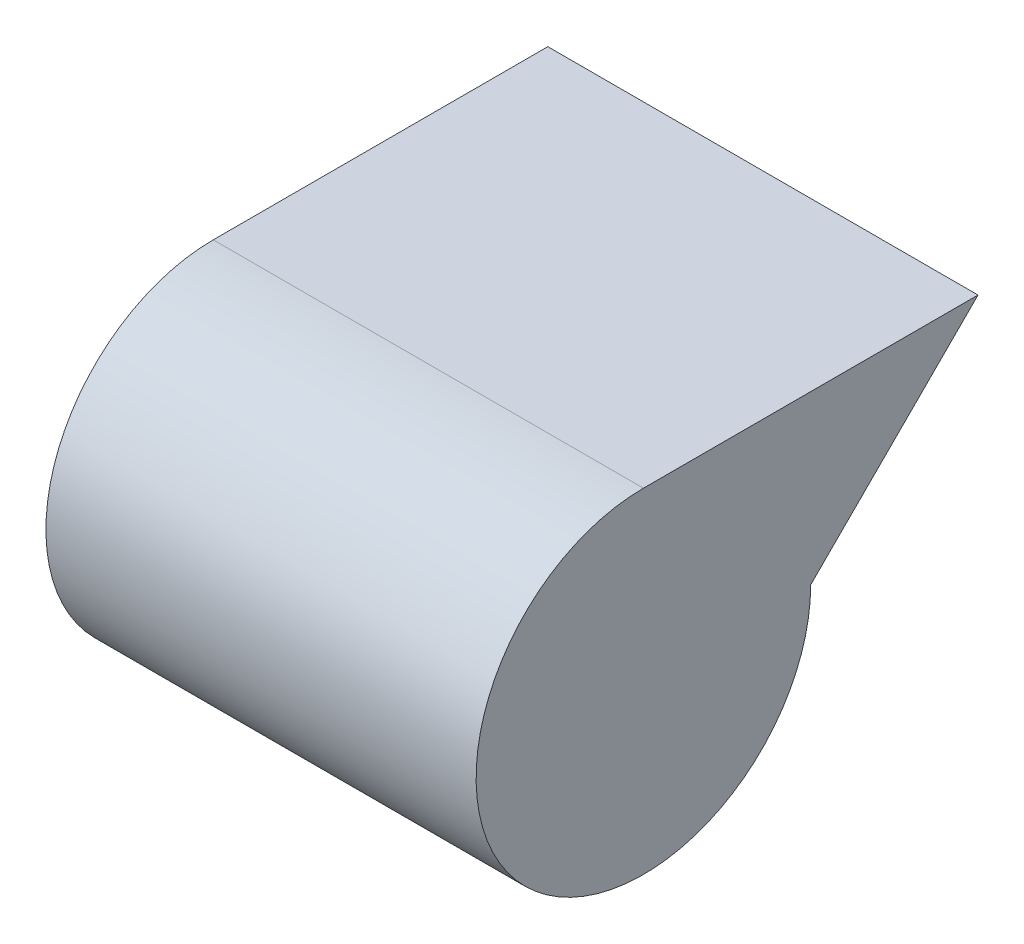
ISO-10303-21;
HEADER;
FILE_DESCRIPTION(('STEP AP214'),'2;1');
FILE_NAME('part.step','',(''),(''),'','','');
FILE_SCHEMA(('AUTOMOTIVE_DESIGN { 1 0 10303 214 1 1 1 1 }'));
ENDSEC;
DATA;
#1=APPLICATION_CONTEXT('core data for automotive mechanical design processes');
#2=APPLICATION_PROTOCOL_DEFINITION('international standard','automotive_design',2000,#1);
#3=PRODUCT_CONTEXT('',#1,'mechanical');
#4=PRODUCT('Part','Part','',(#3));
#5=PRODUCT_RELATED_PRODUCT_CATEGORY('part','',(#4));
#6=PRODUCT_DEFINITION_FORMATION('','',#4);
#7=PRODUCT_DEFINITION_CONTEXT('part definition',#1,'design');
#8=PRODUCT_DEFINITION('design','',#6,#7);
#9=PRODUCT_DEFINITION_SHAPE('','',#8);
#10=(LENGTH_UNIT() NAMED_UNIT(*) SI_UNIT(.MILLI.,.METRE.));
#11=(NAMED_UNIT(*) PLANE_ANGLE_UNIT() SI_UNIT($,.RADIAN.));
#12=(NAMED_UNIT(*) SI_UNIT($,.STERADIAN.) SOLID_ANGLE_UNIT());
#13=UNCERTAINTY_MEASURE_WITH_UNIT(LENGTH_MEASURE(1.E-05),#10,'distance_accuracy_value','');
#14=(GEOMETRIC_REPRESENTATION_CONTEXT(3) GLOBAL_UNCERTAINTY_ASSIGNED_CONTEXT((#13)) GLOBAL_UNIT_ASSIGNED_CONTEXT((#10,
#11,#12)) REPRESENTATION_CONTEXT('',''));
#15=CARTESIAN_POINT('',(0.,0.,0.));
#16=DIRECTION('',(0.,0.,1.));
#17=DIRECTION('',(1.,0.,0.));
#18=AXIS2_PLACEMENT_3D('',#15,#16,#17);
#19=CARTESIAN_POINT('',(90.,0.,0.));
#20=DIRECTION('',(-1.,0.,0.));
#21=DIRECTION('',(0.,0.,1.));
#22=AXIS2_PLACEMENT_3D('',#19,#20,#21);
#23=CYLINDRICAL_SURFACE('',#22,35.);
#24=CARTESIAN_POINT('',(0.,0.,0.));
#25=DIRECTION('',(1.,0.,0.));
#26=DIRECTION('',(0.,0.,-1.));
#27=AXIS2_PLACEMENT_3D('',#24,#25,#26);
#28=CIRCLE('',#27,35.);
#29=CARTESIAN_POINT('',(0.,35.,0.));
#30=VERTEX_POINT('',#29);
#31=CARTESIAN_POINT('',(0.,1.14491749414469E-13,-35.));
#32=VERTEX_POINT('',#31);
#33=EDGE_CURVE('E41',#30,#32,#28,.T.);
#34=ORIENTED_EDGE('',*,*,#33,.T.);
#35=DIRECTION('',(-1.,0.,0.));
#36=VECTOR('',#35,1.);
#37=CARTESIAN_POINT('',(90.,1.17961196366423E-13,-35.));
#38=LINE('',#37,#36);
#39=CARTESIAN_POINT('',(90.,1.14491749414469E-13,-35.));
#40=VERTEX_POINT('',#39);
#41=EDGE_CURVE('E84',#40,#32,#38,.T.);
#42=ORIENTED_EDGE('',*,*,#41,.F.);
#43=CARTESIAN_POINT('',(90.,0.,0.));
#44=DIRECTION('',(1.,0.,0.));
#45=DIRECTION('',(0.,0.,-1.));
#46=AXIS2_PLACEMENT_3D('',#43,#44,#45);
#47=CIRCLE('',#46,35.);
#48=CARTESIAN_POINT('',(90.,35.,0.));
#49=VERTEX_POINT('',#48);
#50=EDGE_CURVE('E11',#49,#40,#47,.T.);
#51=ORIENTED_EDGE('',*,*,#50,.F.);
#52=DIRECTION('',(-1.,0.,0.));
#53=VECTOR('',#52,1.);
#54=CARTESIAN_POINT('',(90.,35.,0.));
#55=LINE('',#54,#53);
#56=EDGE_CURVE('E85',#49,#30,#55,.T.);
#57=ORIENTED_EDGE('',*,*,#56,.T.);
#58=EDGE_LOOP('',(#34,#42,#51,#57));
#59=FACE_BOUND('',#58,.T.);
#60=ADVANCED_FACE('F38',(#59),#23,.T.);
#61=CARTESIAN_POINT('',(90.,0.,0.));
#62=DIRECTION('',(1.,0.,0.));
#63=DIRECTION('',(0.,0.,-1.));
#64=AXIS2_PLACEMENT_3D('',#61,#62,#63);
#65=PLANE('',#64);
#66=ORIENTED_EDGE('',*,*,#50,.T.);
#67=DIRECTION('',(0.,0.707106781186549,-0.707106781186546));
#68=VECTOR('',#67,1.);
#69=CARTESIAN_POINT('',(90.,-35.,0.));
#70=LINE('',#69,#68);
#71=CARTESIAN_POINT('',(90.,35.,-69.9999999999998));
#72=VERTEX_POINT('',#71);
#73=EDGE_CURVE('E66',#40,#72,#70,.T.);
#74=ORIENTED_EDGE('',*,*,#73,.T.);
#75=DIRECTION('',(0.,0.,1.));
#76=VECTOR('',#75,1.);
#77=CARTESIAN_POINT('',(90.,35.,-69.9999999999998));
#78=LINE('',#77,#76);
#79=EDGE_CURVE('E70',#72,#49,#78,.T.);
#80=ORIENTED_EDGE('',*,*,#79,.T.);
#81=EDGE_LOOP('',(#66,#74,#80));
#82=FACE_BOUND('',#81,.T.);
#83=ADVANCED_FACE('F68',(#82),#65,.T.);
#84=CARTESIAN_POINT('',(0.,0.,0.));
#85=DIRECTION('',(1.,0.,0.));
#86=DIRECTION('',(0.,0.,-1.));
#87=AXIS2_PLACEMENT_3D('',#84,#85,#86);
#88=PLANE('',#87);
#89=ORIENTED_EDGE('',*,*,#33,.F.);
#90=DIRECTION('',(0.,0.,1.));
#91=VECTOR('',#90,1.);
#92=CARTESIAN_POINT('',(0.,35.,0.));
#93=LINE('',#92,#91);
#94=CARTESIAN_POINT('',(0.,35.,-69.9999999999998));
#95=VERTEX_POINT('',#94);
#96=EDGE_CURVE('E74',#95,#30,#93,.T.);
#97=ORIENTED_EDGE('',*,*,#96,.F.);
#98=DIRECTION('',(0.,0.707106781186549,-0.707106781186546));
#99=VECTOR('',#98,1.);
#100=CARTESIAN_POINT('',(0.,-35.,0.));
#101=LINE('',#100,#99);
#102=EDGE_CURVE('E80',#32,#95,#101,.T.);
#103=ORIENTED_EDGE('',*,*,#102,.F.);
#104=EDGE_LOOP('',(#89,#97,#103));
#105=FACE_BOUND('',#104,.T.);
#106=ADVANCED_FACE('F94',(#105),#88,.F.);
#107=CARTESIAN_POINT('',(90.,-35.,0.));
#108=DIRECTION('',(0.,0.707106781186546,0.707106781186549));
#109=DIRECTION('',(0.,-0.707106781186549,0.707106781186546));
#110=AXIS2_PLACEMENT_3D('',#107,#108,#109);
#111=PLANE('',#110);
#112=ORIENTED_EDGE('',*,*,#73,.F.);
#113=ORIENTED_EDGE('',*,*,#41,.T.);
#114=ORIENTED_EDGE('',*,*,#102,.T.);
#115=DIRECTION('',(-1.,0.,0.));
#116=VECTOR('',#115,1.);
#117=CARTESIAN_POINT('',(90.,35.,-69.9999999999998));
#118=LINE('',#117,#116);
#119=EDGE_CURVE('E77',#72,#95,#118,.T.);
#120=ORIENTED_EDGE('',*,*,#119,.F.);
#121=EDGE_LOOP('',(#112,#113,#114,#120));
#122=FACE_BOUND('',#121,.T.);
#123=ADVANCED_FACE('F78',(#122),#111,.F.);
#124=CARTESIAN_POINT('',(90.,35.,0.));
#125=DIRECTION('',(0.,-1.,0.));
#126=DIRECTION('',(0.,0.,-1.));
#127=AXIS2_PLACEMENT_3D('',#124,#125,#126);
#128=PLANE('',#127);
#129=ORIENTED_EDGE('',*,*,#96,.T.);
#130=ORIENTED_EDGE('',*,*,#56,.F.);
#131=ORIENTED_EDGE('',*,*,#79,.F.);
#132=ORIENTED_EDGE('',*,*,#119,.T.);
#133=EDGE_LOOP('',(#129,#130,#131,#132));
#134=FACE_BOUND('',#133,.T.);
#135=ADVANCED_FACE('F87',(#134),#128,.F.);
#136=CLOSED_SHELL('',(#60,#83,#106,#123,#135));
#137=MANIFOLD_SOLID_BREP('B2',#136);
#138=ADVANCED_BREP_SHAPE_REPRESENTATION('',(#18,#137),#14);
#139=SHAPE_DEFINITION_REPRESENTATION(#9,#138);
ENDSEC;
END-ISO-10303-21;
